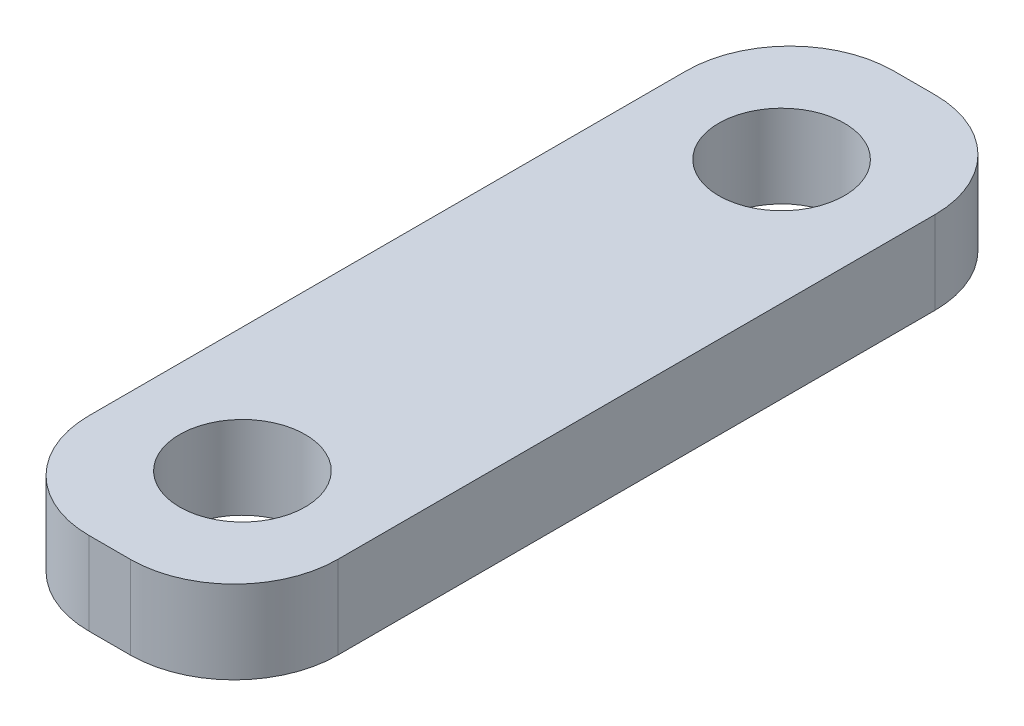
ISO-10303-21;
HEADER;
FILE_DESCRIPTION(('STEP AP214'),'2;1');
FILE_NAME('part.step','',(''),(''),'','','');
FILE_SCHEMA(('AUTOMOTIVE_DESIGN { 1 0 10303 214 1 1 1 1 }'));
ENDSEC;
DATA;
#1=APPLICATION_CONTEXT('core data for automotive mechanical design processes');
#2=APPLICATION_PROTOCOL_DEFINITION('international standard','automotive_design',2000,#1);
#3=PRODUCT_CONTEXT('',#1,'mechanical');
#4=PRODUCT('Part','Part','',(#3));
#5=PRODUCT_RELATED_PRODUCT_CATEGORY('part','',(#4));
#6=PRODUCT_DEFINITION_FORMATION('','',#4);
#7=PRODUCT_DEFINITION_CONTEXT('part definition',#1,'design');
#8=PRODUCT_DEFINITION('design','',#6,#7);
#9=PRODUCT_DEFINITION_SHAPE('','',#8);
#10=(LENGTH_UNIT() NAMED_UNIT(*) SI_UNIT(.MILLI.,.METRE.));
#11=(NAMED_UNIT(*) PLANE_ANGLE_UNIT() SI_UNIT($,.RADIAN.));
#12=(NAMED_UNIT(*) SI_UNIT($,.STERADIAN.) SOLID_ANGLE_UNIT());
#13=UNCERTAINTY_MEASURE_WITH_UNIT(LENGTH_MEASURE(1.E-05),#10,'distance_accuracy_value','');
#14=(GEOMETRIC_REPRESENTATION_CONTEXT(3) GLOBAL_UNCERTAINTY_ASSIGNED_CONTEXT((#13)) GLOBAL_UNIT_ASSIGNED_CONTEXT((#10,
#11,#12)) REPRESENTATION_CONTEXT('',''));
#15=CARTESIAN_POINT('',(0.,0.,0.));
#16=DIRECTION('',(0.,0.,1.));
#17=DIRECTION('',(1.,0.,0.));
#18=AXIS2_PLACEMENT_3D('',#15,#16,#17);
#19=CARTESIAN_POINT('',(3.5,2.,-16.9));
#20=DIRECTION('',(0.,-1.,0.));
#21=DIRECTION('',(0.,0.,-1.));
#22=AXIS2_PLACEMENT_3D('',#19,#20,#21);
#23=CYLINDRICAL_SURFACE('',#22,2.5);
#24=CARTESIAN_POINT('',(3.5,0.,-16.9));
#25=DIRECTION('',(0.,-1.,0.));
#26=DIRECTION('',(0.,0.,-1.));
#27=AXIS2_PLACEMENT_3D('',#24,#25,#26);
#28=CIRCLE('',#27,2.5);
#29=CARTESIAN_POINT('',(3.5,0.,-19.4));
#30=VERTEX_POINT('',#29);
#31=CARTESIAN_POINT('',(6.,0.,-16.9));
#32=VERTEX_POINT('',#31);
#33=EDGE_CURVE('E132',#30,#32,#28,.T.);
#34=ORIENTED_EDGE('',*,*,#33,.F.);
#35=DIRECTION('',(0.,-1.,0.));
#36=VECTOR('',#35,1.);
#37=CARTESIAN_POINT('',(3.5,2.,-19.4));
#38=LINE('',#37,#36);
#39=CARTESIAN_POINT('',(3.5,2.,-19.4));
#40=VERTEX_POINT('',#39);
#41=EDGE_CURVE('E11',#40,#30,#38,.T.);
#42=ORIENTED_EDGE('',*,*,#41,.F.);
#43=CARTESIAN_POINT('',(3.5,2.,-16.9));
#44=DIRECTION('',(0.,-1.,0.));
#45=DIRECTION('',(0.,0.,-1.));
#46=AXIS2_PLACEMENT_3D('',#43,#44,#45);
#47=CIRCLE('',#46,2.5);
#48=CARTESIAN_POINT('',(6.,2.,-16.9));
#49=VERTEX_POINT('',#48);
#50=EDGE_CURVE('E153',#40,#49,#47,.T.);
#51=ORIENTED_EDGE('',*,*,#50,.T.);
#52=DIRECTION('',(0.,-1.,0.));
#53=VECTOR('',#52,1.);
#54=CARTESIAN_POINT('',(6.,2.,-16.9));
#55=LINE('',#54,#53);
#56=EDGE_CURVE('E38',#49,#32,#55,.T.);
#57=ORIENTED_EDGE('',*,*,#56,.T.);
#58=EDGE_LOOP('',(#34,#42,#51,#57));
#59=FACE_BOUND('',#58,.T.);
#60=ADVANCED_FACE('F35',(#59),#23,.T.);
#61=CARTESIAN_POINT('',(2.5,2.,-19.4));
#62=DIRECTION('',(0.,0.,-1.));
#63=DIRECTION('',(-1.,0.,0.));
#64=AXIS2_PLACEMENT_3D('',#61,#62,#63);
#65=PLANE('',#64);
#66=DIRECTION('',(1.,0.,0.));
#67=VECTOR('',#66,1.);
#68=CARTESIAN_POINT('',(2.5,0.,-19.4));
#69=LINE('',#68,#67);
#70=CARTESIAN_POINT('',(2.5,0.,-19.4));
#71=VERTEX_POINT('',#70);
#72=EDGE_CURVE('E151',#71,#30,#69,.T.);
#73=ORIENTED_EDGE('',*,*,#72,.F.);
#74=DIRECTION('',(0.,-1.,0.));
#75=VECTOR('',#74,1.);
#76=CARTESIAN_POINT('',(2.5,2.,-19.4));
#77=LINE('',#76,#75);
#78=CARTESIAN_POINT('',(2.5,2.,-19.4));
#79=VERTEX_POINT('',#78);
#80=EDGE_CURVE('E44',#79,#71,#77,.T.);
#81=ORIENTED_EDGE('',*,*,#80,.F.);
#82=DIRECTION('',(1.,0.,0.));
#83=VECTOR('',#82,1.);
#84=CARTESIAN_POINT('',(2.5,2.,-19.4));
#85=LINE('',#84,#83);
#86=EDGE_CURVE('E122',#79,#40,#85,.T.);
#87=ORIENTED_EDGE('',*,*,#86,.T.);
#88=ORIENTED_EDGE('',*,*,#41,.T.);
#89=EDGE_LOOP('',(#73,#81,#87,#88));
#90=FACE_BOUND('',#89,.T.);
#91=ADVANCED_FACE('F165',(#90),#65,.T.);
#92=CARTESIAN_POINT('',(2.5,2.,-16.9));
#93=DIRECTION('',(0.,-1.,0.));
#94=DIRECTION('',(0.,0.,-1.));
#95=AXIS2_PLACEMENT_3D('',#92,#93,#94);
#96=CYLINDRICAL_SURFACE('',#95,2.5);
#97=CARTESIAN_POINT('',(2.5,0.,-16.9));
#98=DIRECTION('',(0.,-1.,0.));
#99=DIRECTION('',(0.,0.,-1.));
#100=AXIS2_PLACEMENT_3D('',#97,#98,#99);
#101=CIRCLE('',#100,2.5);
#102=CARTESIAN_POINT('',(0.,0.,-16.9));
#103=VERTEX_POINT('',#102);
#104=EDGE_CURVE('E109',#103,#71,#101,.T.);
#105=ORIENTED_EDGE('',*,*,#104,.F.);
#106=DIRECTION('',(0.,-1.,0.));
#107=VECTOR('',#106,1.);
#108=CARTESIAN_POINT('',(0.,2.,-16.9));
#109=LINE('',#108,#107);
#110=CARTESIAN_POINT('',(0.,2.,-16.9));
#111=VERTEX_POINT('',#110);
#112=EDGE_CURVE('E104',#111,#103,#109,.T.);
#113=ORIENTED_EDGE('',*,*,#112,.F.);
#114=CARTESIAN_POINT('',(2.5,2.,-16.9));
#115=DIRECTION('',(0.,-1.,0.));
#116=DIRECTION('',(0.,0.,-1.));
#117=AXIS2_PLACEMENT_3D('',#114,#115,#116);
#118=CIRCLE('',#117,2.5);
#119=EDGE_CURVE('E107',#111,#79,#118,.T.);
#120=ORIENTED_EDGE('',*,*,#119,.T.);
#121=ORIENTED_EDGE('',*,*,#80,.T.);
#122=EDGE_LOOP('',(#105,#113,#120,#121));
#123=FACE_BOUND('',#122,.T.);
#124=ADVANCED_FACE('F106',(#123),#96,.T.);
#125=CARTESIAN_POINT('',(0.,2.,-2.5));
#126=DIRECTION('',(-1.,0.,0.));
#127=DIRECTION('',(0.,0.,1.));
#128=AXIS2_PLACEMENT_3D('',#125,#126,#127);
#129=PLANE('',#128);
#130=DIRECTION('',(0.,0.,-1.));
#131=VECTOR('',#130,1.);
#132=CARTESIAN_POINT('',(0.,0.,-2.5));
#133=LINE('',#132,#131);
#134=CARTESIAN_POINT('',(0.,0.,-2.5));
#135=VERTEX_POINT('',#134);
#136=EDGE_CURVE('E148',#135,#103,#133,.T.);
#137=ORIENTED_EDGE('',*,*,#136,.F.);
#138=DIRECTION('',(0.,-1.,0.));
#139=VECTOR('',#138,1.);
#140=CARTESIAN_POINT('',(0.,2.,-2.5));
#141=LINE('',#140,#139);
#142=CARTESIAN_POINT('',(0.,2.,-2.5));
#143=VERTEX_POINT('',#142);
#144=EDGE_CURVE('E114',#143,#135,#141,.T.);
#145=ORIENTED_EDGE('',*,*,#144,.F.);
#146=DIRECTION('',(0.,0.,-1.));
#147=VECTOR('',#146,1.);
#148=CARTESIAN_POINT('',(0.,2.,-2.5));
#149=LINE('',#148,#147);
#150=EDGE_CURVE('E120',#143,#111,#149,.T.);
#151=ORIENTED_EDGE('',*,*,#150,.T.);
#152=ORIENTED_EDGE('',*,*,#112,.T.);
#153=EDGE_LOOP('',(#137,#145,#151,#152));
#154=FACE_BOUND('',#153,.T.);
#155=ADVANCED_FACE('F124',(#154),#129,.T.);
#156=CARTESIAN_POINT('',(2.5,2.,-2.5));
#157=DIRECTION('',(0.,-1.,0.));
#158=DIRECTION('',(0.,0.,-1.));
#159=AXIS2_PLACEMENT_3D('',#156,#157,#158);
#160=CYLINDRICAL_SURFACE('',#159,2.5);
#161=CARTESIAN_POINT('',(2.5,0.,-2.5));
#162=DIRECTION('',(0.,-1.,0.));
#163=DIRECTION('',(0.,0.,-1.));
#164=AXIS2_PLACEMENT_3D('',#161,#162,#163);
#165=CIRCLE('',#164,2.5);
#166=CARTESIAN_POINT('',(2.5,0.,0.));
#167=VERTEX_POINT('',#166);
#168=EDGE_CURVE('E145',#167,#135,#165,.T.);
#169=ORIENTED_EDGE('',*,*,#168,.F.);
#170=DIRECTION('',(0.,-1.,0.));
#171=VECTOR('',#170,1.);
#172=CARTESIAN_POINT('',(2.5,2.,0.));
#173=LINE('',#172,#171);
#174=CARTESIAN_POINT('',(2.5,2.,0.));
#175=VERTEX_POINT('',#174);
#176=EDGE_CURVE('E157',#175,#167,#173,.T.);
#177=ORIENTED_EDGE('',*,*,#176,.F.);
#178=CARTESIAN_POINT('',(2.5,2.,-2.5));
#179=DIRECTION('',(0.,-1.,0.));
#180=DIRECTION('',(0.,0.,-1.));
#181=AXIS2_PLACEMENT_3D('',#178,#179,#180);
#182=CIRCLE('',#181,2.5);
#183=EDGE_CURVE('E125',#175,#143,#182,.T.);
#184=ORIENTED_EDGE('',*,*,#183,.T.);
#185=ORIENTED_EDGE('',*,*,#144,.T.);
#186=EDGE_LOOP('',(#169,#177,#184,#185));
#187=FACE_BOUND('',#186,.T.);
#188=ADVANCED_FACE('F178',(#187),#160,.T.);
#189=CARTESIAN_POINT('',(3.5,2.,0.));
#190=DIRECTION('',(0.,0.,1.));
#191=DIRECTION('',(1.,0.,0.));
#192=AXIS2_PLACEMENT_3D('',#189,#190,#191);
#193=PLANE('',#192);
#194=DIRECTION('',(-1.,0.,0.));
#195=VECTOR('',#194,1.);
#196=CARTESIAN_POINT('',(3.5,0.,0.));
#197=LINE('',#196,#195);
#198=CARTESIAN_POINT('',(3.5,0.,0.));
#199=VERTEX_POINT('',#198);
#200=EDGE_CURVE('E142',#199,#167,#197,.T.);
#201=ORIENTED_EDGE('',*,*,#200,.F.);
#202=DIRECTION('',(0.,-1.,0.));
#203=VECTOR('',#202,1.);
#204=CARTESIAN_POINT('',(3.5,2.,0.));
#205=LINE('',#204,#203);
#206=CARTESIAN_POINT('',(3.5,2.,0.));
#207=VERTEX_POINT('',#206);
#208=EDGE_CURVE('E159',#207,#199,#205,.T.);
#209=ORIENTED_EDGE('',*,*,#208,.F.);
#210=DIRECTION('',(-1.,0.,0.));
#211=VECTOR('',#210,1.);
#212=CARTESIAN_POINT('',(3.5,2.,0.));
#213=LINE('',#212,#211);
#214=EDGE_CURVE('E127',#207,#175,#213,.T.);
#215=ORIENTED_EDGE('',*,*,#214,.T.);
#216=ORIENTED_EDGE('',*,*,#176,.T.);
#217=EDGE_LOOP('',(#201,#209,#215,#216));
#218=FACE_BOUND('',#217,.T.);
#219=ADVANCED_FACE('F181',(#218),#193,.T.);
#220=CARTESIAN_POINT('',(3.5,2.,-2.5));
#221=DIRECTION('',(0.,-1.,0.));
#222=DIRECTION('',(0.,0.,-1.));
#223=AXIS2_PLACEMENT_3D('',#220,#221,#222);
#224=CYLINDRICAL_SURFACE('',#223,2.5);
#225=CARTESIAN_POINT('',(3.5,0.,-2.5));
#226=DIRECTION('',(0.,-1.,0.));
#227=DIRECTION('',(0.,0.,-1.));
#228=AXIS2_PLACEMENT_3D('',#225,#226,#227);
#229=CIRCLE('',#228,2.5);
#230=CARTESIAN_POINT('',(6.,0.,-2.5));
#231=VERTEX_POINT('',#230);
#232=EDGE_CURVE('E139',#231,#199,#229,.T.);
#233=ORIENTED_EDGE('',*,*,#232,.F.);
#234=DIRECTION('',(0.,-1.,0.));
#235=VECTOR('',#234,1.);
#236=CARTESIAN_POINT('',(6.,2.,-2.5));
#237=LINE('',#236,#235);
#238=CARTESIAN_POINT('',(6.,2.,-2.5));
#239=VERTEX_POINT('',#238);
#240=EDGE_CURVE('E160',#239,#231,#237,.T.);
#241=ORIENTED_EDGE('',*,*,#240,.F.);
#242=CARTESIAN_POINT('',(3.5,2.,-2.5));
#243=DIRECTION('',(0.,-1.,0.));
#244=DIRECTION('',(0.,0.,-1.));
#245=AXIS2_PLACEMENT_3D('',#242,#243,#244);
#246=CIRCLE('',#245,2.5);
#247=EDGE_CURVE('E227',#239,#207,#246,.T.);
#248=ORIENTED_EDGE('',*,*,#247,.T.);
#249=ORIENTED_EDGE('',*,*,#208,.T.);
#250=EDGE_LOOP('',(#233,#241,#248,#249));
#251=FACE_BOUND('',#250,.T.);
#252=ADVANCED_FACE('F185',(#251),#224,.T.);
#253=CARTESIAN_POINT('',(6.,2.,-16.9));
#254=DIRECTION('',(1.,0.,0.));
#255=DIRECTION('',(0.,0.,-1.));
#256=AXIS2_PLACEMENT_3D('',#253,#254,#255);
#257=PLANE('',#256);
#258=DIRECTION('',(0.,0.,1.));
#259=VECTOR('',#258,1.);
#260=CARTESIAN_POINT('',(6.,0.,-16.9));
#261=LINE('',#260,#259);
#262=EDGE_CURVE('E135',#32,#231,#261,.T.);
#263=ORIENTED_EDGE('',*,*,#262,.F.);
#264=ORIENTED_EDGE('',*,*,#56,.F.);
#265=DIRECTION('',(0.,0.,1.));
#266=VECTOR('',#265,1.);
#267=CARTESIAN_POINT('',(6.,2.,-16.9));
#268=LINE('',#267,#266);
#269=EDGE_CURVE('E225',#49,#239,#268,.T.);
#270=ORIENTED_EDGE('',*,*,#269,.T.);
#271=ORIENTED_EDGE('',*,*,#240,.T.);
#272=EDGE_LOOP('',(#263,#264,#270,#271));
#273=FACE_BOUND('',#272,.T.);
#274=ADVANCED_FACE('F162',(#273),#257,.T.);
#275=CARTESIAN_POINT('',(3.5,2.,-16.9));
#276=DIRECTION('',(0.,-1.,0.));
#277=DIRECTION('',(0.,0.,-1.));
#278=AXIS2_PLACEMENT_3D('',#275,#276,#277);
#279=PLANE('',#278);
#280=CARTESIAN_POINT('',(3.,2.,-16.2));
#281=DIRECTION('',(0.,-1.,0.));
#282=DIRECTION('',(0.,0.,1.));
#283=AXIS2_PLACEMENT_3D('',#280,#281,#282);
#284=CIRCLE('',#283,1.515);
#285=CARTESIAN_POINT('',(3.,2.,-14.685));
#286=VERTEX_POINT('',#285);
#287=EDGE_CURVE('E212',#286,#286,#284,.T.);
#288=ORIENTED_EDGE('',*,*,#287,.T.);
#289=EDGE_LOOP('',(#288));
#290=FACE_BOUND('',#289,.T.);
#291=CARTESIAN_POINT('',(3.,2.,-3.2));
#292=DIRECTION('',(0.,-1.,0.));
#293=DIRECTION('',(0.,0.,1.));
#294=AXIS2_PLACEMENT_3D('',#291,#292,#293);
#295=CIRCLE('',#294,1.515);
#296=CARTESIAN_POINT('',(3.,2.,-1.685));
#297=VERTEX_POINT('',#296);
#298=EDGE_CURVE('E136',#297,#297,#295,.T.);
#299=ORIENTED_EDGE('',*,*,#298,.T.);
#300=EDGE_LOOP('',(#299));
#301=FACE_BOUND('',#300,.T.);
#302=ORIENTED_EDGE('',*,*,#50,.F.);
#303=ORIENTED_EDGE('',*,*,#86,.F.);
#304=ORIENTED_EDGE('',*,*,#119,.F.);
#305=ORIENTED_EDGE('',*,*,#150,.F.);
#306=ORIENTED_EDGE('',*,*,#183,.F.);
#307=ORIENTED_EDGE('',*,*,#214,.F.);
#308=ORIENTED_EDGE('',*,*,#247,.F.);
#309=ORIENTED_EDGE('',*,*,#269,.F.);
#310=EDGE_LOOP('',(#302,#303,#304,#305,#306,#307,#308,#309));
#311=FACE_BOUND('',#310,.T.);
#312=ADVANCED_FACE('F118',(#290,#301,#311),#279,.F.);
#313=CARTESIAN_POINT('',(3.5,0.,-16.9));
#314=DIRECTION('',(0.,-1.,0.));
#315=DIRECTION('',(0.,0.,-1.));
#316=AXIS2_PLACEMENT_3D('',#313,#314,#315);
#317=PLANE('',#316);
#318=CARTESIAN_POINT('',(3.,0.,-16.2));
#319=DIRECTION('',(0.,-1.,0.));
#320=DIRECTION('',(0.,0.,1.));
#321=AXIS2_PLACEMENT_3D('',#318,#319,#320);
#322=CIRCLE('',#321,1.515);
#323=CARTESIAN_POINT('',(3.,0.,-14.685));
#324=VERTEX_POINT('',#323);
#325=EDGE_CURVE('E215',#324,#324,#322,.T.);
#326=ORIENTED_EDGE('',*,*,#325,.F.);
#327=EDGE_LOOP('',(#326));
#328=FACE_BOUND('',#327,.T.);
#329=CARTESIAN_POINT('',(3.,0.,-3.2));
#330=DIRECTION('',(0.,-1.,0.));
#331=DIRECTION('',(0.,0.,1.));
#332=AXIS2_PLACEMENT_3D('',#329,#330,#331);
#333=CIRCLE('',#332,1.515);
#334=CARTESIAN_POINT('',(3.,0.,-1.685));
#335=VERTEX_POINT('',#334);
#336=EDGE_CURVE('E217',#335,#335,#333,.T.);
#337=ORIENTED_EDGE('',*,*,#336,.F.);
#338=EDGE_LOOP('',(#337));
#339=FACE_BOUND('',#338,.T.);
#340=ORIENTED_EDGE('',*,*,#33,.T.);
#341=ORIENTED_EDGE('',*,*,#262,.T.);
#342=ORIENTED_EDGE('',*,*,#232,.T.);
#343=ORIENTED_EDGE('',*,*,#200,.T.);
#344=ORIENTED_EDGE('',*,*,#168,.T.);
#345=ORIENTED_EDGE('',*,*,#136,.T.);
#346=ORIENTED_EDGE('',*,*,#104,.T.);
#347=ORIENTED_EDGE('',*,*,#72,.T.);
#348=EDGE_LOOP('',(#340,#341,#342,#343,#344,#345,#346,#347));
#349=FACE_BOUND('',#348,.T.);
#350=ADVANCED_FACE('F164',(#328,#339,#349),#317,.T.);
#351=CARTESIAN_POINT('',(3.,2.,-3.2));
#352=DIRECTION('',(0.,-1.,0.));
#353=DIRECTION('',(0.,0.,-1.));
#354=AXIS2_PLACEMENT_3D('',#351,#352,#353);
#355=CYLINDRICAL_SURFACE('',#354,1.515);
#356=ORIENTED_EDGE('',*,*,#298,.F.);
#357=EDGE_LOOP('',(#356));
#358=FACE_BOUND('',#357,.T.);
#359=ORIENTED_EDGE('',*,*,#336,.T.);
#360=EDGE_LOOP('',(#359));
#361=FACE_BOUND('',#360,.T.);
#362=ADVANCED_FACE('F197',(#358,#361),#355,.F.);
#363=CARTESIAN_POINT('',(3.,2.,-16.2));
#364=DIRECTION('',(0.,-1.,0.));
#365=DIRECTION('',(0.,0.,-1.));
#366=AXIS2_PLACEMENT_3D('',#363,#364,#365);
#367=CYLINDRICAL_SURFACE('',#366,1.515);
#368=ORIENTED_EDGE('',*,*,#287,.F.);
#369=EDGE_LOOP('',(#368));
#370=FACE_BOUND('',#369,.T.);
#371=ORIENTED_EDGE('',*,*,#325,.T.);
#372=EDGE_LOOP('',(#371));
#373=FACE_BOUND('',#372,.T.);
#374=ADVANCED_FACE('F204',(#370,#373),#367,.F.);
#375=CLOSED_SHELL('',(#60,#91,#124,#155,#188,#219,#252,#274,#312,#350,#362,#374));
#376=MANIFOLD_SOLID_BREP('B2',#375);
#377=ADVANCED_BREP_SHAPE_REPRESENTATION('',(#18,#376),#14);
#378=SHAPE_DEFINITION_REPRESENTATION(#9,#377);
ENDSEC;
END-ISO-10303-21;
